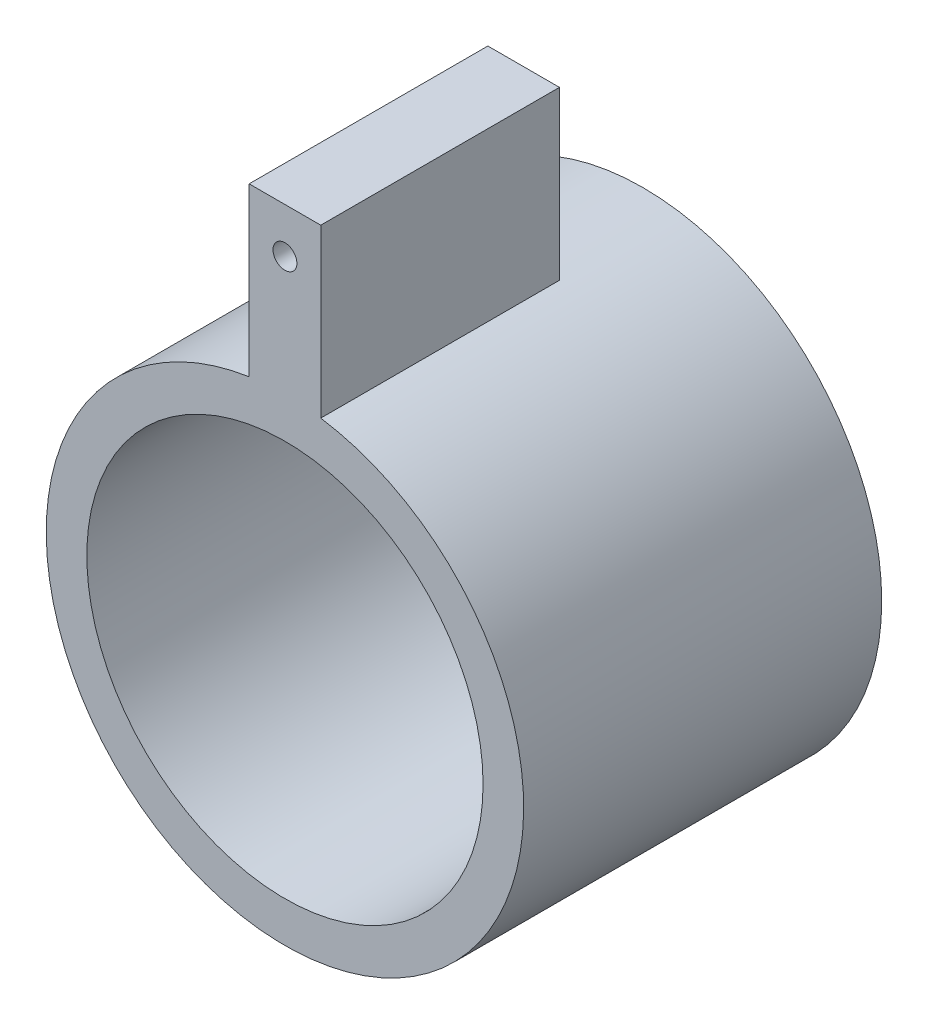
ISO-10303-21;
HEADER;
FILE_DESCRIPTION(('STEP AP214'),'2;1');
FILE_NAME('part.step','',(''),(''),'','','');
FILE_SCHEMA(('AUTOMOTIVE_DESIGN { 1 0 10303 214 1 1 1 1 }'));
ENDSEC;
DATA;
#1=APPLICATION_CONTEXT('core data for automotive mechanical design processes');
#2=APPLICATION_PROTOCOL_DEFINITION('international standard','automotive_design',2000,#1);
#3=PRODUCT_CONTEXT('',#1,'mechanical');
#4=PRODUCT('Part','Part','',(#3));
#5=PRODUCT_RELATED_PRODUCT_CATEGORY('part','',(#4));
#6=PRODUCT_DEFINITION_FORMATION('','',#4);
#7=PRODUCT_DEFINITION_CONTEXT('part definition',#1,'design');
#8=PRODUCT_DEFINITION('design','',#6,#7);
#9=PRODUCT_DEFINITION_SHAPE('','',#8);
#10=(LENGTH_UNIT() NAMED_UNIT(*) SI_UNIT(.MILLI.,.METRE.));
#11=(NAMED_UNIT(*) PLANE_ANGLE_UNIT() SI_UNIT($,.RADIAN.));
#12=(NAMED_UNIT(*) SI_UNIT($,.STERADIAN.) SOLID_ANGLE_UNIT());
#13=UNCERTAINTY_MEASURE_WITH_UNIT(LENGTH_MEASURE(1.E-05),#10,'distance_accuracy_value','');
#14=(GEOMETRIC_REPRESENTATION_CONTEXT(3) GLOBAL_UNCERTAINTY_ASSIGNED_CONTEXT((#13)) GLOBAL_UNIT_ASSIGNED_CONTEXT((#10,
#11,#12)) REPRESENTATION_CONTEXT('',''));
#15=CARTESIAN_POINT('',(0.,0.,0.));
#16=DIRECTION('',(0.,0.,1.));
#17=DIRECTION('',(1.,0.,0.));
#18=AXIS2_PLACEMENT_3D('',#15,#16,#17);
#19=CARTESIAN_POINT('',(0.,0.,15.));
#20=DIRECTION('',(0.,0.,1.));
#21=DIRECTION('',(1.,0.,0.));
#22=AXIS2_PLACEMENT_3D('',#19,#20,#21);
#23=PLANE('',#22);
#24=CARTESIAN_POINT('',(0.,0.,15.));
#25=DIRECTION('',(0.,0.,1.));
#26=DIRECTION('',(1.,0.,0.));
#27=AXIS2_PLACEMENT_3D('',#24,#25,#26);
#28=CIRCLE('',#27,10.);
#29=CARTESIAN_POINT('',(-1.5,9.88685996664259,15.));
#30=VERTEX_POINT('',#29);
#31=CARTESIAN_POINT('',(1.5,9.88685996664259,15.));
#32=VERTEX_POINT('',#31);
#33=EDGE_CURVE('E130',#30,#32,#28,.T.);
#34=ORIENTED_EDGE('',*,*,#33,.T.);
#35=DIRECTION('',(0.,1.,0.));
#36=VECTOR('',#35,1.);
#37=CARTESIAN_POINT('',(1.5,9.88685996664259,15.));
#38=LINE('',#37,#36);
#39=CARTESIAN_POINT('',(1.5,16.8868599666426,15.));
#40=VERTEX_POINT('',#39);
#41=EDGE_CURVE('E112',#32,#40,#38,.T.);
#42=ORIENTED_EDGE('',*,*,#41,.T.);
#43=DIRECTION('',(-1.,0.,0.));
#44=VECTOR('',#43,1.);
#45=CARTESIAN_POINT('',(-1.5,16.8868599666426,15.));
#46=LINE('',#45,#44);
#47=CARTESIAN_POINT('',(-1.5,16.8868599666426,15.));
#48=VERTEX_POINT('',#47);
#49=EDGE_CURVE('E92',#40,#48,#46,.T.);
#50=ORIENTED_EDGE('',*,*,#49,.T.);
#51=DIRECTION('',(0.,-1.,0.));
#52=VECTOR('',#51,1.);
#53=CARTESIAN_POINT('',(-1.5,9.88685996664259,15.));
#54=LINE('',#53,#52);
#55=EDGE_CURVE('E55',#48,#30,#54,.T.);
#56=ORIENTED_EDGE('',*,*,#55,.T.);
#57=EDGE_LOOP('',(#34,#42,#50,#56));
#58=FACE_BOUND('',#57,.T.);
#59=CARTESIAN_POINT('',(0.,0.,15.));
#60=DIRECTION('',(0.,0.,1.));
#61=DIRECTION('',(1.,0.,0.));
#62=AXIS2_PLACEMENT_3D('',#59,#60,#61);
#63=CIRCLE('',#62,8.3);
#64=CARTESIAN_POINT('',(8.3,0.,15.));
#65=VERTEX_POINT('',#64);
#66=EDGE_CURVE('E121',#65,#65,#63,.T.);
#67=ORIENTED_EDGE('',*,*,#66,.F.);
#68=EDGE_LOOP('',(#67));
#69=FACE_BOUND('',#68,.T.);
#70=CARTESIAN_POINT('',(0.,15.,15.));
#71=DIRECTION('',(0.,0.,1.));
#72=DIRECTION('',(1.,0.,0.));
#73=AXIS2_PLACEMENT_3D('',#70,#71,#72);
#74=CIRCLE('',#73,0.5);
#75=CARTESIAN_POINT('',(0.5,15.,15.));
#76=VERTEX_POINT('',#75);
#77=EDGE_CURVE('E107',#76,#76,#74,.T.);
#78=ORIENTED_EDGE('',*,*,#77,.F.);
#79=EDGE_LOOP('',(#78));
#80=FACE_BOUND('',#79,.T.);
#81=ADVANCED_FACE('F39',(#58,#69,#80),#23,.T.);
#82=CARTESIAN_POINT('',(0.,0.,0.));
#83=DIRECTION('',(0.,0.,1.));
#84=DIRECTION('',(1.,0.,0.));
#85=AXIS2_PLACEMENT_3D('',#82,#83,#84);
#86=PLANE('',#85);
#87=CARTESIAN_POINT('',(0.,0.,0.));
#88=DIRECTION('',(0.,0.,1.));
#89=DIRECTION('',(1.,0.,0.));
#90=AXIS2_PLACEMENT_3D('',#87,#88,#89);
#91=CIRCLE('',#90,10.);
#92=CARTESIAN_POINT('',(10.,0.,0.));
#93=VERTEX_POINT('',#92);
#94=EDGE_CURVE('E129',#93,#93,#91,.T.);
#95=ORIENTED_EDGE('',*,*,#94,.F.);
#96=EDGE_LOOP('',(#95));
#97=FACE_BOUND('',#96,.T.);
#98=ADVANCED_FACE('F149',(#97),#86,.F.);
#99=CARTESIAN_POINT('',(0.,0.,15.));
#100=DIRECTION('',(0.,0.,-1.));
#101=DIRECTION('',(-1.,0.,0.));
#102=AXIS2_PLACEMENT_3D('',#99,#100,#101);
#103=CYLINDRICAL_SURFACE('',#102,10.);
#104=ORIENTED_EDGE('',*,*,#33,.F.);
#105=DIRECTION('',(0.,0.,1.));
#106=VECTOR('',#105,1.);
#107=CARTESIAN_POINT('',(-1.5,9.88685996664259,5.));
#108=LINE('',#107,#106);
#109=CARTESIAN_POINT('',(-1.5,9.88685996664259,5.));
#110=VERTEX_POINT('',#109);
#111=EDGE_CURVE('E118',#110,#30,#108,.T.);
#112=ORIENTED_EDGE('',*,*,#111,.F.);
#113=CARTESIAN_POINT('',(0.,0.,5.));
#114=DIRECTION('',(0.,0.,1.));
#115=DIRECTION('',(1.,0.,0.));
#116=AXIS2_PLACEMENT_3D('',#113,#114,#115);
#117=CIRCLE('',#116,10.);
#118=CARTESIAN_POINT('',(1.5,9.88685996664259,5.));
#119=VERTEX_POINT('',#118);
#120=EDGE_CURVE('E11',#119,#110,#117,.T.);
#121=ORIENTED_EDGE('',*,*,#120,.F.);
#122=DIRECTION('',(0.,0.,1.));
#123=VECTOR('',#122,1.);
#124=CARTESIAN_POINT('',(1.5,9.88685996664259,5.));
#125=LINE('',#124,#123);
#126=EDGE_CURVE('E86',#119,#32,#125,.T.);
#127=ORIENTED_EDGE('',*,*,#126,.T.);
#128=EDGE_LOOP('',(#104,#112,#121,#127));
#129=FACE_BOUND('',#128,.T.);
#130=ORIENTED_EDGE('',*,*,#94,.T.);
#131=EDGE_LOOP('',(#130));
#132=FACE_BOUND('',#131,.T.);
#133=ADVANCED_FACE('F41',(#129,#132),#103,.T.);
#134=CARTESIAN_POINT('',(0.,0.,15.));
#135=DIRECTION('',(0.,0.,-1.));
#136=DIRECTION('',(-1.,0.,0.));
#137=AXIS2_PLACEMENT_3D('',#134,#135,#136);
#138=CYLINDRICAL_SURFACE('',#137,8.3);
#139=CARTESIAN_POINT('',(0.,0.,2.));
#140=DIRECTION('',(0.,0.,1.));
#141=DIRECTION('',(1.,0.,0.));
#142=AXIS2_PLACEMENT_3D('',#139,#140,#141);
#143=CIRCLE('',#142,8.3);
#144=CARTESIAN_POINT('',(8.3,0.,2.));
#145=VERTEX_POINT('',#144);
#146=EDGE_CURVE('E48',#145,#145,#143,.T.);
#147=ORIENTED_EDGE('',*,*,#146,.F.);
#148=EDGE_LOOP('',(#147));
#149=FACE_BOUND('',#148,.T.);
#150=ORIENTED_EDGE('',*,*,#66,.T.);
#151=EDGE_LOOP('',(#150));
#152=FACE_BOUND('',#151,.T.);
#153=ADVANCED_FACE('F141',(#149,#152),#138,.F.);
#154=CARTESIAN_POINT('',(0.,0.,2.));
#155=DIRECTION('',(0.,0.,1.));
#156=DIRECTION('',(1.,0.,0.));
#157=AXIS2_PLACEMENT_3D('',#154,#155,#156);
#158=PLANE('',#157);
#159=ORIENTED_EDGE('',*,*,#146,.T.);
#160=EDGE_LOOP('',(#159));
#161=FACE_BOUND('',#160,.T.);
#162=ADVANCED_FACE('F139',(#161),#158,.T.);
#163=CARTESIAN_POINT('',(-1.5,9.88685996664259,5.));
#164=DIRECTION('',(-1.,0.,0.));
#165=DIRECTION('',(0.,-1.,0.));
#166=AXIS2_PLACEMENT_3D('',#163,#164,#165);
#167=PLANE('',#166);
#168=ORIENTED_EDGE('',*,*,#55,.F.);
#169=DIRECTION('',(0.,0.,1.));
#170=VECTOR('',#169,1.);
#171=CARTESIAN_POINT('',(-1.5,16.8868599666426,5.));
#172=LINE('',#171,#170);
#173=CARTESIAN_POINT('',(-1.5,16.8868599666426,5.));
#174=VERTEX_POINT('',#173);
#175=EDGE_CURVE('E80',#174,#48,#172,.T.);
#176=ORIENTED_EDGE('',*,*,#175,.F.);
#177=DIRECTION('',(0.,-1.,0.));
#178=VECTOR('',#177,1.);
#179=CARTESIAN_POINT('',(-1.5,9.88685996664259,5.));
#180=LINE('',#179,#178);
#181=EDGE_CURVE('E98',#174,#110,#180,.T.);
#182=ORIENTED_EDGE('',*,*,#181,.T.);
#183=ORIENTED_EDGE('',*,*,#111,.T.);
#184=EDGE_LOOP('',(#168,#176,#182,#183));
#185=FACE_BOUND('',#184,.T.);
#186=ADVANCED_FACE('F168',(#185),#167,.T.);
#187=CARTESIAN_POINT('',(-1.5,16.8868599666426,5.));
#188=DIRECTION('',(0.,1.,0.));
#189=DIRECTION('',(0.,0.,1.));
#190=AXIS2_PLACEMENT_3D('',#187,#188,#189);
#191=PLANE('',#190);
#192=ORIENTED_EDGE('',*,*,#49,.F.);
#193=DIRECTION('',(0.,0.,1.));
#194=VECTOR('',#193,1.);
#195=CARTESIAN_POINT('',(1.5,16.8868599666426,5.));
#196=LINE('',#195,#194);
#197=CARTESIAN_POINT('',(1.5,16.8868599666426,5.));
#198=VERTEX_POINT('',#197);
#199=EDGE_CURVE('E88',#198,#40,#196,.T.);
#200=ORIENTED_EDGE('',*,*,#199,.F.);
#201=DIRECTION('',(-1.,0.,0.));
#202=VECTOR('',#201,1.);
#203=CARTESIAN_POINT('',(-1.5,16.8868599666426,5.));
#204=LINE('',#203,#202);
#205=EDGE_CURVE('E91',#198,#174,#204,.T.);
#206=ORIENTED_EDGE('',*,*,#205,.T.);
#207=ORIENTED_EDGE('',*,*,#175,.T.);
#208=EDGE_LOOP('',(#192,#200,#206,#207));
#209=FACE_BOUND('',#208,.T.);
#210=ADVANCED_FACE('F90',(#209),#191,.T.);
#211=CARTESIAN_POINT('',(1.5,9.88685996664259,5.));
#212=DIRECTION('',(1.,0.,0.));
#213=DIRECTION('',(0.,0.,-1.));
#214=AXIS2_PLACEMENT_3D('',#211,#212,#213);
#215=PLANE('',#214);
#216=ORIENTED_EDGE('',*,*,#41,.F.);
#217=ORIENTED_EDGE('',*,*,#126,.F.);
#218=DIRECTION('',(0.,1.,0.));
#219=VECTOR('',#218,1.);
#220=CARTESIAN_POINT('',(1.5,9.88685996664259,5.));
#221=LINE('',#220,#219);
#222=EDGE_CURVE('E97',#119,#198,#221,.T.);
#223=ORIENTED_EDGE('',*,*,#222,.T.);
#224=ORIENTED_EDGE('',*,*,#199,.T.);
#225=EDGE_LOOP('',(#216,#217,#223,#224));
#226=FACE_BOUND('',#225,.T.);
#227=ADVANCED_FACE('F101',(#226),#215,.T.);
#228=CARTESIAN_POINT('',(0.,0.,5.));
#229=DIRECTION('',(0.,0.,1.));
#230=DIRECTION('',(1.,0.,0.));
#231=AXIS2_PLACEMENT_3D('',#228,#229,#230);
#232=PLANE('',#231);
#233=CARTESIAN_POINT('',(0.,15.,5.));
#234=DIRECTION('',(0.,0.,1.));
#235=DIRECTION('',(1.,0.,0.));
#236=AXIS2_PLACEMENT_3D('',#233,#234,#235);
#237=CIRCLE('',#236,0.5);
#238=CARTESIAN_POINT('',(0.5,15.,5.));
#239=VERTEX_POINT('',#238);
#240=EDGE_CURVE('E115',#239,#239,#237,.T.);
#241=ORIENTED_EDGE('',*,*,#240,.T.);
#242=EDGE_LOOP('',(#241));
#243=FACE_BOUND('',#242,.T.);
#244=ORIENTED_EDGE('',*,*,#222,.F.);
#245=ORIENTED_EDGE('',*,*,#120,.T.);
#246=ORIENTED_EDGE('',*,*,#181,.F.);
#247=ORIENTED_EDGE('',*,*,#205,.F.);
#248=EDGE_LOOP('',(#244,#245,#246,#247));
#249=FACE_BOUND('',#248,.T.);
#250=ADVANCED_FACE('F96',(#243,#249),#232,.F.);
#251=CARTESIAN_POINT('',(0.,15.,5.));
#252=DIRECTION('',(0.,0.,1.));
#253=DIRECTION('',(1.,0.,0.));
#254=AXIS2_PLACEMENT_3D('',#251,#252,#253);
#255=CYLINDRICAL_SURFACE('',#254,0.5);
#256=ORIENTED_EDGE('',*,*,#240,.F.);
#257=EDGE_LOOP('',(#256));
#258=FACE_BOUND('',#257,.T.);
#259=ORIENTED_EDGE('',*,*,#77,.T.);
#260=EDGE_LOOP('',(#259));
#261=FACE_BOUND('',#260,.T.);
#262=ADVANCED_FACE('F160',(#258,#261),#255,.F.);
#263=CLOSED_SHELL('',(#81,#98,#133,#153,#162,#186,#210,#227,#250,#262));
#264=MANIFOLD_SOLID_BREP('B2',#263);
#265=ADVANCED_BREP_SHAPE_REPRESENTATION('',(#18,#264),#14);
#266=SHAPE_DEFINITION_REPRESENTATION(#9,#265);
ENDSEC;
END-ISO-10303-21;
